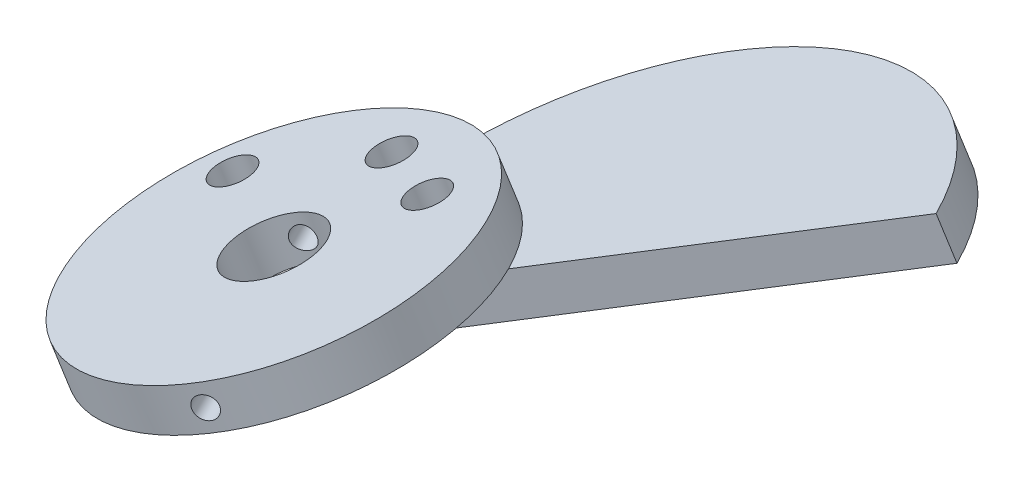
ISO-10303-21;
HEADER;
FILE_DESCRIPTION(('STEP AP214'),'2;1');
FILE_NAME('part.step','',(''),(''),'','','');
FILE_SCHEMA(('AUTOMOTIVE_DESIGN { 1 0 10303 214 1 1 1 1 }'));
ENDSEC;
DATA;
#1=APPLICATION_CONTEXT('core data for automotive mechanical design processes');
#2=APPLICATION_PROTOCOL_DEFINITION('international standard','automotive_design',2000,#1);
#3=PRODUCT_CONTEXT('',#1,'mechanical');
#4=PRODUCT('Part','Part','',(#3));
#5=PRODUCT_RELATED_PRODUCT_CATEGORY('part','',(#4));
#6=PRODUCT_DEFINITION_FORMATION('','',#4);
#7=PRODUCT_DEFINITION_CONTEXT('part definition',#1,'design');
#8=PRODUCT_DEFINITION('design','',#6,#7);
#9=PRODUCT_DEFINITION_SHAPE('','',#8);
#10=(LENGTH_UNIT() NAMED_UNIT(*) SI_UNIT(.MILLI.,.METRE.));
#11=(NAMED_UNIT(*) PLANE_ANGLE_UNIT() SI_UNIT($,.RADIAN.));
#12=(NAMED_UNIT(*) SI_UNIT($,.STERADIAN.) SOLID_ANGLE_UNIT());
#13=UNCERTAINTY_MEASURE_WITH_UNIT(LENGTH_MEASURE(1.E-05),#10,'distance_accuracy_value','');
#14=(GEOMETRIC_REPRESENTATION_CONTEXT(3) GLOBAL_UNCERTAINTY_ASSIGNED_CONTEXT((#13)) GLOBAL_UNIT_ASSIGNED_CONTEXT((#10,
#11,#12)) REPRESENTATION_CONTEXT('',''));
#15=CARTESIAN_POINT('',(0.,0.,0.));
#16=DIRECTION('',(0.,0.,1.));
#17=DIRECTION('',(1.,0.,0.));
#18=AXIS2_PLACEMENT_3D('',#15,#16,#17);
#19=CARTESIAN_POINT('',(34.7138651051531,-26.8297353879861,274.813581931701));
#20=DIRECTION('',(-0.314185564785192,0.933512565093415,0.172747566389002));
#21=DIRECTION('',(-0.947761081473609,-0.318981084774592,0.));
#22=AXIS2_PLACEMENT_3D('',#19,#20,#21);
#23=CYLINDRICAL_SURFACE('',#22,12.7);
#24=CARTESIAN_POINT('',(27.9034193202308,-25.115711909382,264.065736755248));
#25=CARTESIAN_POINT('',(27.9034914489556,-25.1620029855068,264.065879602236));
#26=CARTESIAN_POINT('',(27.9069841501051,-25.208326720369,264.064137742992));
#27=CARTESIAN_POINT('',(27.9207001292124,-25.2996987240285,264.056860896095));
#28=CARTESIAN_POINT('',(27.9309310396158,-25.3447454859606,264.05132160676));
#29=CARTESIAN_POINT('',(27.9578210658462,-25.4322292751593,264.036580308741));
#30=CARTESIAN_POINT('',(27.974477414144,-25.4746674168854,264.02737987691));
#31=CARTESIAN_POINT('',(28.0137466169364,-25.5557346131928,264.00559302488));
#32=CARTESIAN_POINT('',(28.036358093149,-25.5943645463236,263.993007388154));
#33=CARTESIAN_POINT('',(28.0869189960037,-25.6667339998765,263.964858151593));
#34=CARTESIAN_POINT('',(28.114868200342,-25.7004737238612,263.949294675778));
#35=CARTESIAN_POINT('',(28.175353696712,-25.7621166605994,263.915711729445));
#36=CARTESIAN_POINT('',(28.207890210015,-25.7900195916507,263.897692140457));
#37=CARTESIAN_POINT('',(28.2767413868408,-25.8392482701955,263.859777252081));
#38=CARTESIAN_POINT('',(28.313062505564,-25.8605625258285,263.839878753542));
#39=CARTESIAN_POINT('',(28.3884665677902,-25.8959494863166,263.798909653409));
#40=CARTESIAN_POINT('',(28.4275495266055,-25.9100221510187,263.777839045316));
#41=CARTESIAN_POINT('',(28.5074725275227,-25.930539993091,263.73521036986));
#42=CARTESIAN_POINT('',(28.5483144233258,-25.9369769088621,263.713651800184));
#43=CARTESIAN_POINT('',(28.6306052585464,-25.9420109433762,263.670779291772));
#44=CARTESIAN_POINT('',(28.6720541915198,-25.9406081452843,263.649465350443));
#45=CARTESIAN_POINT('',(28.7543626632941,-25.9300069535991,263.607787600748));
#46=CARTESIAN_POINT('',(28.7952228842991,-25.9208184711544,263.587422619118));
#47=CARTESIAN_POINT('',(28.8752626396245,-25.894918746378,263.54823209723));
#48=CARTESIAN_POINT('',(28.9144421908815,-25.878207579874,263.529406541459));
#49=CARTESIAN_POINT('',(28.989942393122,-25.8377720152415,263.493860130602));
#50=CARTESIAN_POINT('',(29.0262676123519,-25.8140591250034,263.477135885645));
#51=CARTESIAN_POINT('',(29.0950823853837,-25.7602842453992,263.446191576529));
#52=CARTESIAN_POINT('',(29.1275719258757,-25.7302222340027,263.43197152106));
#53=CARTESIAN_POINT('',(29.1877796095922,-25.6645834412548,263.406357782607));
#54=CARTESIAN_POINT('',(29.2154951325161,-25.629003651606,263.394965650271));
#55=CARTESIAN_POINT('',(29.2653056529814,-25.5533460041669,263.375240335296));
#56=CARTESIAN_POINT('',(29.2874005779582,-25.5132680883131,263.366907192149));
#57=CARTESIAN_POINT('',(29.3253291849025,-25.4296632851965,263.353408916635));
#58=CARTESIAN_POINT('',(29.3411510287991,-25.3861300613201,263.348249763954));
#59=CARTESIAN_POINT('',(29.3659695041109,-25.296908476277,263.341155078864));
#60=CARTESIAN_POINT('',(29.3749661230837,-25.2512201111817,263.339219552331));
#61=CARTESIAN_POINT('',(29.3858267280125,-25.1589657868759,263.338523578122));
#62=CARTESIAN_POINT('',(29.3876886651177,-25.1123995794345,263.339764042317));
#63=CARTESIAN_POINT('',(29.3841770500245,-25.019724441808,263.345306336851));
#64=CARTESIAN_POINT('',(29.3788035860221,-24.9736155060558,263.349608129872));
#65=CARTESIAN_POINT('',(29.3609627332386,-24.8832481043627,263.361091391816));
#66=CARTESIAN_POINT('',(29.3485078385913,-24.8389865262777,263.368267782366));
#67=CARTESIAN_POINT('',(29.31686103838,-24.7534873834626,263.385283994607));
#68=CARTESIAN_POINT('',(29.297669181011,-24.7122497971019,263.395123797245));
#69=CARTESIAN_POINT('',(29.2531326951869,-24.6340125712909,263.417201219357));
#70=CARTESIAN_POINT('',(29.2277946054813,-24.5970084891359,263.429436287946));
#71=CARTESIAN_POINT('',(29.171705749792,-24.5282340493483,263.456025677534));
#72=CARTESIAN_POINT('',(29.1409549334862,-24.4964637403795,263.470380018236));
#73=CARTESIAN_POINT('',(29.0749128461548,-24.4390154506888,263.500912423679));
#74=CARTESIAN_POINT('',(29.0396157431163,-24.4133454179248,263.51709282755));
#75=CARTESIAN_POINT('',(28.9655631452603,-24.368875202877,263.550914728562));
#76=CARTESIAN_POINT('',(28.9268076158337,-24.3500750893514,263.568556240325));
#77=CARTESIAN_POINT('',(28.8469222213204,-24.3198528098611,263.604948261984));
#78=CARTESIAN_POINT('',(28.8057885938874,-24.3084427038479,263.623700530405));
#79=CARTESIAN_POINT('',(28.7224223585892,-24.2933774059686,263.661866305932));
#80=CARTESIAN_POINT('',(28.6801897532805,-24.2897221960654,263.6812798115));
#81=CARTESIAN_POINT('',(28.5958927795759,-24.2902762835641,263.720295735645));
#82=CARTESIAN_POINT('',(28.5538283282112,-24.2944810472164,263.739898038831));
#83=CARTESIAN_POINT('',(28.4710703481219,-24.3106316331998,263.778805192604));
#84=CARTESIAN_POINT('',(28.430376804283,-24.3225773701574,263.798110046467));
#85=CARTESIAN_POINT('',(28.3516066744462,-24.353842090537,263.835861081302));
#86=CARTESIAN_POINT('',(28.3135253683547,-24.3731473384422,263.854308790492));
#87=CARTESIAN_POINT('',(28.2409729675021,-24.4185820504637,263.889844892094));
#88=CARTESIAN_POINT('',(28.2065017321525,-24.4447112486932,263.906933337436));
#89=CARTESIAN_POINT('',(28.142130389797,-24.5030383208624,263.9392108425));
#90=CARTESIAN_POINT('',(28.112228672794,-24.5352340483876,263.954400570861));
#91=CARTESIAN_POINT('',(28.0577767957731,-24.6047957224406,263.982381079073));
#92=CARTESIAN_POINT('',(28.0332279752362,-24.6421629592447,263.995171258363));
#93=CARTESIAN_POINT('',(27.9900824864828,-24.721086432502,264.017909358774));
#94=CARTESIAN_POINT('',(27.971499163499,-24.7626517913218,264.02785090204));
#95=CARTESIAN_POINT('',(27.9408432052906,-24.8486962135781,264.04444905524));
#96=CARTESIAN_POINT('',(27.9287631178511,-24.8931718761691,264.051109424404));
#97=CARTESIAN_POINT('',(27.9144856297953,-24.9675447580369,264.059113754472));
#98=CARTESIAN_POINT('',(27.910298854702,-24.9969663903056,264.061507194439));
#99=CARTESIAN_POINT('',(27.9047424939901,-25.056158144658,264.064772742167));
#100=CARTESIAN_POINT('',(27.9033729126657,-25.0859282672728,264.065644847608));
#101=CARTESIAN_POINT('',(27.9034193202308,-25.115711909382,264.065736755248));
#102=B_SPLINE_CURVE_WITH_KNOTS('',3,(#24,#25,#26,#27,#28,#29,#30,#31,#32,#33,#34,#35,#36,#37,
#38,#39,#40,#41,#42,#43,#44,#45,#46,#47,#48,#49,#50,#51,#52,#53,#54,#55,#56,#57,#58,#59,#60,#61,
#62,#63,#64,#65,#66,#67,#68,#69,#70,#71,#72,#73,#74,#75,#76,#77,#78,#79,#80,#81,#82,#83,#84,#85,
#86,#87,#88,#89,#90,#91,#92,#93,#94,#95,#96,#97,#98,#99,#100,#101),.UNSPECIFIED.,.T.,.F.,(4,2,2,
2,2,2,2,2,2,2,2,2,2,2,2,2,2,2,2,2,2,2,2,2,2,2,2,2,2,2,2,2,2,2,2,2,2,2,4),(0.,0.138765678526406,
0.277688809450887,0.416552170861587,0.555383421304641,0.694208891014165,0.833041059337556,
0.972114027685706,1.11118776715525,1.25041184243902,1.3896344408115,1.52868007511127,
1.66772430788034,1.80654127053479,1.9453587148688,2.08425211039882,2.22314729902203,
2.36230336631217,2.50145968728247,2.6406559664704,2.77985054893667,2.91880030194514,
3.05774906095489,3.19655064088989,3.33535351133192,3.47433624643409,3.6133203725184,
3.75253074281306,3.89174078931994,4.03087056218161,4.16999880064055,4.30886863662699,
4.44773306252775,4.58654844838611,4.72539853092309,4.86455710045018,5.00355586352064,
5.09283745626833,5.18211918510799),.UNSPECIFIED.);
#103=CARTESIAN_POINT('',(27.9034193202308,-25.115711909382,264.065736755248));
#104=VERTEX_POINT('',#103);
#105=EDGE_CURVE('E145',#104,#104,#102,.T.);
#106=ORIENTED_EDGE('',*,*,#105,.T.);
#107=EDGE_LOOP('',(#106));
#108=FACE_BOUND('',#107,.T.);
#109=CARTESIAN_POINT('',(34.7138651051531,-26.8297353879861,274.813581931701));
#110=DIRECTION('',(-0.314185564785192,0.933512565093415,0.172747566389002));
#111=DIRECTION('',(-0.947761081473609,-0.318981084774592,0.));
#112=AXIS2_PLACEMENT_3D('',#109,#110,#111);
#113=CIRCLE('',#112,12.7);
#114=CARTESIAN_POINT('',(45.4015764436263,-22.2821574693871,269.677205639047));
#115=VERTEX_POINT('',#114);
#116=CARTESIAN_POINT('',(33.0151322846113,-25.0946721899854,262.347874470696));
#117=VERTEX_POINT('',#116);
#118=EDGE_CURVE('E11',#115,#117,#113,.T.);
#119=ORIENTED_EDGE('',*,*,#118,.T.);
#120=EDGE_CURVE('E45',#117,#115,#113,.T.);
#121=ORIENTED_EDGE('',*,*,#120,.T.);
#122=EDGE_LOOP('',(#119,#121));
#123=FACE_BOUND('',#122,.T.);
#124=CARTESIAN_POINT('',(33.7163259369601,-23.8658329938145,275.362055454986));
#125=DIRECTION('',(-0.314185564785192,0.933512565093415,0.172747566389002));
#126=DIRECTION('',(-0.947761081473609,-0.318981084774592,0.));
#127=AXIS2_PLACEMENT_3D('',#124,#125,#126);
#128=CIRCLE('',#127,12.7);
#129=CARTESIAN_POINT('',(21.6797602022453,-27.9168927704518,275.362055454986));
#130=VERTEX_POINT('',#129);
#131=EDGE_CURVE('E108',#130,#130,#128,.T.);
#132=ORIENTED_EDGE('',*,*,#131,.F.);
#133=EDGE_LOOP('',(#132));
#134=FACE_BOUND('',#133,.T.);
#135=CARTESIAN_POINT('',(39.043756682219,-25.5798564724186,286.835481358948));
#136=CARTESIAN_POINT('',(39.044575633925,-25.5334963106448,286.83715060336));
#137=CARTESIAN_POINT('',(39.0489989031034,-25.487111208081,286.837269846749));
#138=CARTESIAN_POINT('',(39.064896889325,-25.3956320186152,286.834307892555));
#139=CARTESIAN_POINT('',(39.0763799436569,-25.3505395242217,286.831222907948));
#140=CARTESIAN_POINT('',(39.1060137889827,-25.2629774860306,286.821828978636));
#141=CARTESIAN_POINT('',(39.1241612178531,-25.2205066322344,286.815521658946));
#142=CARTESIAN_POINT('',(39.1665500905697,-25.1393772220626,286.799747664675));
#143=CARTESIAN_POINT('',(39.1907900521388,-25.1007177415831,286.790281758376));
#144=CARTESIAN_POINT('',(39.2446419499824,-25.0282733075498,286.768342634154));
#145=CARTESIAN_POINT('',(39.2742564550038,-24.9944906988044,286.755867977266));
#146=CARTESIAN_POINT('',(39.3379683385905,-24.9327820846493,286.728175856794));
#147=CARTESIAN_POINT('',(39.3720658392182,-24.9048562387604,286.712958318523));
#148=CARTESIAN_POINT('',(39.4436868406127,-24.855698729756,286.680178235952));
#149=CARTESIAN_POINT('',(39.4812048315612,-24.8344565378299,286.662619442617));
#150=CARTESIAN_POINT('',(39.55863319693,-24.7992120320002,286.625613066307));
#151=CARTESIAN_POINT('',(39.5985435450518,-24.7852096385276,286.606165504094));
#152=CARTESIAN_POINT('',(39.6795716543356,-24.76485628681,286.565976908176));
#153=CARTESIAN_POINT('',(39.7206876944038,-24.7584949184681,286.545237674877));
#154=CARTESIAN_POINT('',(39.8030386716075,-24.7535666388234,286.503080752456));
#155=CARTESIAN_POINT('',(39.8442736093119,-24.7549997648758,286.481663060084));
#156=CARTESIAN_POINT('',(39.9257765955032,-24.7656226111352,286.438816039762));
#157=CARTESIAN_POINT('',(39.9660436791163,-24.7748197664043,286.417386720342));
#158=CARTESIAN_POINT('',(40.0444854621299,-24.8007198202694,286.375245840521));
#159=CARTESIAN_POINT('',(40.082660133762,-24.8174228184486,286.354534289645));
#160=CARTESIAN_POINT('',(40.1559633858175,-24.8579019772007,286.314491473289));
#161=CARTESIAN_POINT('',(40.1910863805983,-24.8816907690666,286.295162749826));
#162=CARTESIAN_POINT('',(40.2572697976736,-24.9356614010602,286.258587106397));
#163=CARTESIAN_POINT('',(40.288330226737,-24.9658432305359,286.241340182961));
#164=CARTESIAN_POINT('',(40.345548827739,-25.0317437128946,286.209518886338));
#165=CARTESIAN_POINT('',(40.3717078029004,-25.067461456827,286.194944075267));
#166=CARTESIAN_POINT('',(40.418417741778,-25.1434253921317,286.168951378895));
#167=CARTESIAN_POINT('',(40.4389687774205,-25.1836715254144,286.157533453103));
#168=CARTESIAN_POINT('',(40.4738605790609,-25.2674679990512,286.138236267522));
#169=CARTESIAN_POINT('',(40.488212905345,-25.3110120091288,286.130350419555));
#170=CARTESIAN_POINT('',(40.5103544499616,-25.4002319311527,286.118308594509));
#171=CARTESIAN_POINT('',(40.5181436964383,-25.4459078339559,286.114152601435));
#172=CARTESIAN_POINT('',(40.5269178750506,-25.5380624529145,286.109648698744));
#173=CARTESIAN_POINT('',(40.5279072690852,-25.5845406225624,286.109298291907));
#174=CARTESIAN_POINT('',(40.5230334259759,-25.6770131467914,286.112333405287));
#175=CARTESIAN_POINT('',(40.517170114326,-25.7230074961067,286.115718966124));
#176=CARTESIAN_POINT('',(40.4986963386078,-25.8132853304527,286.126038355949));
#177=CARTESIAN_POINT('',(40.4860751913971,-25.857565987212,286.132977802347));
#178=CARTESIAN_POINT('',(40.4543812011222,-25.9430877030783,286.150098113812));
#179=CARTESIAN_POINT('',(40.435308299786,-25.9843287347274,286.160279008155));
#180=CARTESIAN_POINT('',(40.3911619432331,-26.0626575206856,286.183496435765));
#181=CARTESIAN_POINT('',(40.3660804010595,-26.0997395778757,286.196536815558));
#182=CARTESIAN_POINT('',(40.3105883465934,-26.1686301743863,286.22499295363));
#183=CARTESIAN_POINT('',(40.2801778690578,-26.2004387480996,286.240408696416));
#184=CARTESIAN_POINT('',(40.2148826988486,-26.2578450980294,286.273081776794));
#185=CARTESIAN_POINT('',(40.1800024407628,-26.2834489582821,286.290337286292));
#186=CARTESIAN_POINT('',(40.1067121786844,-26.3277536630874,286.326163492294));
#187=CARTESIAN_POINT('',(40.0683022211711,-26.3464545985217,286.344734171479));
#188=CARTESIAN_POINT('',(39.989112657247,-26.3763930109237,286.382616815726));
#189=CARTESIAN_POINT('',(39.948337395517,-26.3876437283737,286.401927400847));
#190=CARTESIAN_POINT('',(39.8655266219706,-26.402418234194,286.440800345236));
#191=CARTESIAN_POINT('',(39.8234911060415,-26.4059419973463,286.460362705325));
#192=CARTESIAN_POINT('',(39.7393736468843,-26.4051678104281,286.499251720985));
#193=CARTESIAN_POINT('',(39.6972916962098,-26.4008683372073,286.518578329918));
#194=CARTESIAN_POINT('',(39.6143220352167,-26.3845721469264,286.556537816606));
#195=CARTESIAN_POINT('',(39.5734343422371,-26.3725753181695,286.57517068429));
#196=CARTESIAN_POINT('',(39.4939833364697,-26.3411972132357,286.611361455177));
#197=CARTESIAN_POINT('',(39.4554245550312,-26.3218020463539,286.628917263735));
#198=CARTESIAN_POINT('',(39.3818630264005,-26.2761799158322,286.662534848789));
#199=CARTESIAN_POINT('',(39.3468601615818,-26.2499531782771,286.678596674703));
#200=CARTESIAN_POINT('',(39.2814360794439,-26.1913938739874,286.708889094844));
#201=CARTESIAN_POINT('',(39.2510173205125,-26.1590580518416,286.72311870589));
#202=CARTESIAN_POINT('',(39.1956878146931,-26.0891969396802,286.749424235534));
#203=CARTESIAN_POINT('',(39.170778323086,-26.0516704701405,286.761499663181));
#204=CARTESIAN_POINT('',(39.1272435305822,-25.9725530559584,286.78319468757));
#205=CARTESIAN_POINT('',(39.1086111265814,-25.9309667745947,286.792817057151));
#206=CARTESIAN_POINT('',(39.0781513738848,-25.8449071556739,286.809364695383));
#207=CARTESIAN_POINT('',(39.0663160947989,-25.8004372502435,286.816293104089));
#208=CARTESIAN_POINT('',(39.052765808179,-25.7263894617051,286.825255167021));
#209=CARTESIAN_POINT('',(39.0489351305265,-25.6972831810705,286.828152523612));
#210=CARTESIAN_POINT('',(39.0441704812169,-25.6387401114428,286.832735486614));
#211=CARTESIAN_POINT('',(39.0432365039523,-25.6093033230896,286.834421095372));
#212=CARTESIAN_POINT('',(39.043756682219,-25.5798564724186,286.835481358948));
#213=B_SPLINE_CURVE_WITH_KNOTS('',3,(#135,#136,#137,#138,#139,#140,#141,#142,#143,#144,#145,
#146,#147,#148,#149,#150,#151,#152,#153,#154,#155,#156,#157,#158,#159,#160,#161,#162,#163,#164,
#165,#166,#167,#168,#169,#170,#171,#172,#173,#174,#175,#176,#177,#178,#179,#180,#181,#182,#183,
#184,#185,#186,#187,#188,#189,#190,#191,#192,#193,#194,#195,#196,#197,#198,#199,#200,#201,#202,
#203,#204,#205,#206,#207,#208,#209,#210,#211,#212),.UNSPECIFIED.,.T.,.F.,(4,2,2,2,2,2,2,2,2,2,2,
2,2,2,2,2,2,2,2,2,2,2,2,2,2,2,2,2,2,2,2,2,2,2,2,2,2,2,4),(0.,0.139084671145376,
0.278333911383219,0.41751299778872,0.556658255469263,0.695870193194237,0.835085922150107,
0.974081232602476,1.11307501539841,1.25187921814807,1.390684086118,1.52962202868416,
1.66856181465141,1.80775077533058,1.94693950409665,2.08610540340532,2.22526951771661,
2.36417296523408,2.50307581709227,2.64188751554408,2.78070072324252,2.91973402488384,
3.05876858230074,3.19799132644983,3.33721316257782,3.47629792719446,3.6153808605993,
3.7542159485074,3.89305148952103,4.03191406410424,4.17077865377828,4.30990526145625,
4.44902726544826,4.58822361500613,4.72745164771054,4.86652159765163,5.00542895954282,
5.0937723413073,5.18211555205394),.UNSPECIFIED.);
#214=CARTESIAN_POINT('',(39.043756682219,-25.5798564724186,286.835481358948));
#215=VERTEX_POINT('',#214);
#216=EDGE_CURVE('E123',#215,#215,#213,.T.);
#217=ORIENTED_EDGE('',*,*,#216,.T.);
#218=EDGE_LOOP('',(#217));
#219=FACE_BOUND('',#218,.T.);
#220=ADVANCED_FACE('F32',(#108,#123,#134,#219),#23,.T.);
#221=CARTESIAN_POINT('',(34.7138651051531,-26.8297353879861,274.813581931701));
#222=DIRECTION('',(-0.314185564785192,0.933512565093415,0.172747566389002));
#223=DIRECTION('',(-0.947761081473609,-0.318981084774592,0.));
#224=AXIS2_PLACEMENT_3D('',#221,#222,#223);
#225=CYLINDRICAL_SURFACE('',#224,3.175);
#226=CARTESIAN_POINT('',(32.1202050853295,-25.2913976290119,272.684428613489));
#227=CARTESIAN_POINT('',(32.1216133960569,-25.3363959199763,272.687305338985));
#228=CARTESIAN_POINT('',(32.1260061295399,-25.3814547450878,272.687916238532));
#229=CARTESIAN_POINT('',(32.1405680630878,-25.4704380518034,272.684298164624));
#230=CARTESIAN_POINT('',(32.1507378627417,-25.5143624151694,272.680068688752));
#231=CARTESIAN_POINT('',(32.1765367214097,-25.5998241195621,272.666754401199));
#232=CARTESIAN_POINT('',(32.1921675346604,-25.6413606885608,272.657668028843));
#233=CARTESIAN_POINT('',(32.2284490082846,-25.7208391052001,272.634949055985));
#234=CARTESIAN_POINT('',(32.2490997539543,-25.7587808917447,272.621316378232));
#235=CARTESIAN_POINT('',(32.2948304868485,-25.8299258325806,272.590153417055));
#236=CARTESIAN_POINT('',(32.3198967103659,-25.8631431484945,272.572635202691));
#237=CARTESIAN_POINT('',(32.3739506873905,-25.9241503356499,272.534477919109));
#238=CARTESIAN_POINT('',(32.4029390895348,-25.9519393073081,272.513838333622));
#239=CARTESIAN_POINT('',(32.4651324979672,-26.0021311400834,272.469749662695));
#240=CARTESIAN_POINT('',(32.4984332795506,-26.0243602299013,272.446237813901));
#241=CARTESIAN_POINT('',(32.5679321338037,-26.0618393527718,272.397958625001));
#242=CARTESIAN_POINT('',(32.6041306101488,-26.0770884114475,272.373191110146));
#243=CARTESIAN_POINT('',(32.6794467340844,-26.1004239024001,272.322993988495));
#244=CARTESIAN_POINT('',(32.7186078170721,-26.1083634377293,272.297560945474));
#245=CARTESIAN_POINT('',(32.7983164288273,-26.1162812263272,272.247642830767));
#246=CARTESIAN_POINT('',(32.838863769399,-26.1162605560017,272.223157631358));
#247=CARTESIAN_POINT('',(32.9195861300862,-26.1082688568959,272.176592703482));
#248=CARTESIAN_POINT('',(32.9597548566423,-26.1004398977567,272.154477810175));
#249=CARTESIAN_POINT('',(33.0393219156569,-26.0772319101548,272.113001011725));
#250=CARTESIAN_POINT('',(33.0787203859107,-26.0618542452115,272.093638610215));
#251=CARTESIAN_POINT('',(33.1545453124506,-26.0245145401453,272.058748733676));
#252=CARTESIAN_POINT('',(33.1910229357932,-26.0027384259359,272.043132987214));
#253=CARTESIAN_POINT('',(33.2610593447568,-25.9531137605002,272.015406744883));
#254=CARTESIAN_POINT('',(33.29461804838,-25.9252650387602,272.003296347463));
#255=CARTESIAN_POINT('',(33.3579593267491,-25.8641577844741,271.982611647062));
#256=CARTESIAN_POINT('',(33.3877237763482,-25.8308748994993,271.974053906419));
#257=CARTESIAN_POINT('',(33.4423934152369,-25.7598962966155,271.960421502877));
#258=CARTESIAN_POINT('',(33.4672977371357,-25.7221997929219,271.955347461312));
#259=CARTESIAN_POINT('',(33.5120911222247,-25.642210939316,271.948297764022));
#260=CARTESIAN_POINT('',(33.5318137557479,-25.5998169967243,271.946416251145));
#261=CARTESIAN_POINT('',(33.5645245799144,-25.5124745976138,271.945625064506));
#262=CARTESIAN_POINT('',(33.5775121302968,-25.4675258986812,271.946715673222));
#263=CARTESIAN_POINT('',(33.5962458228494,-25.3757541146258,271.951429276902));
#264=CARTESIAN_POINT('',(33.6019118937599,-25.3289159871066,271.955079610881));
#265=CARTESIAN_POINT('',(33.6053127425988,-25.2351606818947,271.964461693924));
#266=CARTESIAN_POINT('',(33.6030492153498,-25.1882435232361,271.97019299798));
#267=CARTESIAN_POINT('',(33.5906265263752,-25.0969249936626,271.98313932959));
#268=CARTESIAN_POINT('',(33.5806713588346,-25.0524899608921,271.990312532891));
#269=CARTESIAN_POINT('',(33.5533323138923,-24.9662054366675,272.005919881167));
#270=CARTESIAN_POINT('',(33.5359494576943,-24.9243555906912,272.014353852702));
#271=CARTESIAN_POINT('',(33.4947935635786,-24.8453771324836,272.032092846975));
#272=CARTESIAN_POINT('',(33.4711727144236,-24.8081636335949,272.041374069416));
#273=CARTESIAN_POINT('',(33.4181725494867,-24.7383840958532,272.060904929502));
#274=CARTESIAN_POINT('',(33.3887926365373,-24.7058185395592,272.071154667516));
#275=CARTESIAN_POINT('',(33.3247231318119,-24.6456635863723,272.09283917245));
#276=CARTESIAN_POINT('',(33.2899540917195,-24.6181649353528,272.104290670106));
#277=CARTESIAN_POINT('',(33.2165939342401,-24.5694906573615,272.128342134015));
#278=CARTESIAN_POINT('',(33.1780021072879,-24.5483162071936,272.140942313446));
#279=CARTESIAN_POINT('',(33.0970034406777,-24.5122975712446,272.167802222823));
#280=CARTESIAN_POINT('',(33.0545175335896,-24.4976590939909,272.182100009235));
#281=CARTESIAN_POINT('',(32.9681127246549,-24.4760837572804,272.212118546654));
#282=CARTESIAN_POINT('',(32.9241938363264,-24.4691468251917,272.227839284241));
#283=CARTESIAN_POINT('',(32.8364239120599,-24.4632447464967,272.260634712985));
#284=CARTESIAN_POINT('',(32.7925729286643,-24.464262798163,272.277706475138));
#285=CARTESIAN_POINT('',(32.7062805516591,-24.474278008433,272.313027338727));
#286=CARTESIAN_POINT('',(32.6638388589505,-24.4832734625882,272.331276187894));
#287=CARTESIAN_POINT('',(32.582928834882,-24.5086392426555,272.368012159299));
#288=CARTESIAN_POINT('',(32.5443810712006,-24.5247886622699,272.386477111318));
#289=CARTESIAN_POINT('',(32.471037162406,-24.5639215822831,272.423605671406));
#290=CARTESIAN_POINT('',(32.4362407328298,-24.5869045639967,272.442269264294));
#291=CARTESIAN_POINT('',(32.3716805790238,-24.638712312113,272.478922331705));
#292=CARTESIAN_POINT('',(32.3418647714247,-24.6674686450626,272.496917020119));
#293=CARTESIAN_POINT('',(32.2874381317645,-24.7301551171658,272.531733378768));
#294=CARTESIAN_POINT('',(32.2628283541022,-24.7640863020135,272.548554810917));
#295=CARTESIAN_POINT('',(32.2187479732544,-24.8370280139531,272.580631825112));
#296=CARTESIAN_POINT('',(32.1994080975341,-24.8761371399187,272.595842677619));
#297=CARTESIAN_POINT('',(32.16689833942,-24.9577603032726,272.623437186808));
#298=CARTESIAN_POINT('',(32.1537273188777,-25.0002737108776,272.635821364792));
#299=CARTESIAN_POINT('',(32.1345344192585,-25.0838498554853,272.656085879005));
#300=CARTESIAN_POINT('',(32.1279953184764,-25.1247231508647,272.66426185911));
#301=CARTESIAN_POINT('',(32.1201741913244,-25.2075126978406,272.677091507922));
#302=CARTESIAN_POINT('',(32.1188915887032,-25.2494288346071,272.681745562681));
#303=CARTESIAN_POINT('',(32.1202050853295,-25.2913976290119,272.684428613489));
#304=B_SPLINE_CURVE_WITH_KNOTS('',3,(#226,#227,#228,#229,#230,#231,#232,#233,#234,#235,#236,
#237,#238,#239,#240,#241,#242,#243,#244,#245,#246,#247,#248,#249,#250,#251,#252,#253,#254,#255,
#256,#257,#258,#259,#260,#261,#262,#263,#264,#265,#266,#267,#268,#269,#270,#271,#272,#273,#274,
#275,#276,#277,#278,#279,#280,#281,#282,#283,#284,#285,#286,#287,#288,#289,#290,#291,#292,#293,
#294,#295,#296,#297,#298,#299,#300,#301,#302,#303),.UNSPECIFIED.,.T.,.F.,(4,2,2,2,2,2,2,2,2,2,2,
2,2,2,2,2,2,2,2,2,2,2,2,2,2,2,2,2,2,2,2,2,2,2,2,2,2,2,4),(0.,0.135191335052145,0.27039670388077,
0.405645544603208,0.540896683568904,0.675733453427245,0.810592549469725,0.949250483807529,
1.08792776819046,1.22933476572717,1.37072264174002,1.50958409183194,1.64842046866388,
1.78356565633783,1.91871463926229,2.05448679130994,2.19028315260332,2.33001850451405,
2.46976713772829,2.61103154306525,2.75226575727583,2.88987763234411,3.02747059378032,
3.16197520380669,3.29649376823642,3.43322684743852,3.56998535403086,3.71078795377371,
3.85158922562066,3.99209319150072,4.13256714459311,4.26897678486515,4.40537607393018,
4.54024506299278,4.67514134153941,4.81312964555387,4.95109248080774,5.07719592406677,
5.20328554268348),.UNSPECIFIED.);
#305=CARTESIAN_POINT('',(32.1202050853295,-25.2913976290119,272.684428613489));
#306=VERTEX_POINT('',#305);
#307=EDGE_CURVE('E124',#306,#306,#304,.T.);
#308=ORIENTED_EDGE('',*,*,#307,.F.);
#309=EDGE_LOOP('',(#308));
#310=FACE_BOUND('',#309,.T.);
#311=CARTESIAN_POINT('',(34.7138651051531,-26.8297353879861,274.813581931701));
#312=DIRECTION('',(-0.314185564785192,0.933512565093415,0.172747566389002));
#313=DIRECTION('',(-0.947761081473609,-0.318981084774592,0.));
#314=AXIS2_PLACEMENT_3D('',#311,#312,#313);
#315=CIRCLE('',#314,3.175);
#316=CARTESIAN_POINT('',(37.3857929397713,-25.6928409083363,273.529487858538));
#317=VERTEX_POINT('',#316);
#318=CARTESIAN_POINT('',(33.5462646354941,-26.6770711472194,271.86501825207));
#319=VERTEX_POINT('',#318);
#320=EDGE_CURVE('E106',#317,#319,#315,.T.);
#321=ORIENTED_EDGE('',*,*,#320,.F.);
#322=EDGE_CURVE('E101',#319,#317,#315,.T.);
#323=ORIENTED_EDGE('',*,*,#322,.F.);
#324=EDGE_LOOP('',(#321,#323));
#325=FACE_BOUND('',#324,.T.);
#326=CARTESIAN_POINT('',(33.7163259369601,-23.8658329938145,275.362055454986));
#327=DIRECTION('',(-0.314185564785192,0.933512565093415,0.172747566389002));
#328=DIRECTION('',(-0.947761081473609,-0.318981084774592,0.));
#329=AXIS2_PLACEMENT_3D('',#326,#327,#328);
#330=CIRCLE('',#329,3.175);
#331=CARTESIAN_POINT('',(30.7071845032814,-24.8785979379738,275.362055454986));
#332=VERTEX_POINT('',#331);
#333=EDGE_CURVE('E98',#332,#332,#330,.T.);
#334=ORIENTED_EDGE('',*,*,#333,.T.);
#335=EDGE_LOOP('',(#334));
#336=FACE_BOUND('',#335,.T.);
#337=CARTESIAN_POINT('',(34.8269709171202,-25.4041707527887,278.216789500708));
#338=CARTESIAN_POINT('',(34.8291855111327,-25.3575874874623,278.221312945638));
#339=CARTESIAN_POINT('',(34.8353056901423,-25.3110713945583,278.224794226007));
#340=CARTESIAN_POINT('',(34.854937844899,-25.219477681355,278.229196942015));
#341=CARTESIAN_POINT('',(34.8684561486532,-25.174401327524,278.2301161821));
#342=CARTESIAN_POINT('',(34.9022450889819,-25.0869426529432,278.228918583921));
#343=CARTESIAN_POINT('',(34.9225097811994,-25.0445579995018,278.226804413039));
#344=CARTESIAN_POINT('',(34.969027694731,-24.9635616480603,278.219127672453));
#345=CARTESIAN_POINT('',(34.9952798977948,-24.9249493101242,278.213565688816));
#346=CARTESIAN_POINT('',(35.0530530010504,-24.8523399758376,278.198647211925));
#347=CARTESIAN_POINT('',(35.0846031237179,-24.8183705860498,278.189269237761));
#348=CARTESIAN_POINT('',(35.1518265958089,-24.7563282154329,278.166596812542));
#349=CARTESIAN_POINT('',(35.1874992709894,-24.7282542725143,278.153303001371));
#350=CARTESIAN_POINT('',(35.2608706455084,-24.6795105621724,278.123317297476));
#351=CARTESIAN_POINT('',(35.2984957386624,-24.6586721993019,278.106719368701));
#352=CARTESIAN_POINT('',(35.3754136561195,-24.6240777497597,278.070324307054));
#353=CARTESIAN_POINT('',(35.4147062633894,-24.6103207444645,278.05052758958));
#354=CARTESIAN_POINT('',(35.49300644512,-24.5904844696374,278.00881458054));
#355=CARTESIAN_POINT('',(35.5320033906088,-24.5842538057899,277.986949970057));
#356=CARTESIAN_POINT('',(35.6095111617626,-24.5790861407432,277.941565052333));
#357=CARTESIAN_POINT('',(35.6480219485364,-24.5801497194042,277.918044613608));
#358=CARTESIAN_POINT('',(35.7242267405153,-24.5895552662799,277.869917779969));
#359=CARTESIAN_POINT('',(35.7619009334791,-24.5980020671736,277.845300610732));
#360=CARTESIAN_POINT('',(35.835069558789,-24.622053720541,277.796320014751));
#361=CARTESIAN_POINT('',(35.8705635730115,-24.6376599412477,277.771956637421));
#362=CARTESIAN_POINT('',(35.9396615925347,-24.6761729667808,277.723848443743));
#363=CARTESIAN_POINT('',(35.9731830190363,-24.6992749712241,277.7001409858));
#364=CARTESIAN_POINT('',(36.0365235874225,-24.7520451928949,277.65520947347));
#365=CARTESIAN_POINT('',(36.0663427012688,-24.7817134598454,277.633985437889));
#366=CARTESIAN_POINT('',(36.1216312098649,-24.8468521970277,277.595061183014));
#367=CARTESIAN_POINT('',(36.1471010922352,-24.8823220159358,277.577360568648));
#368=CARTESIAN_POINT('',(36.1930649958729,-24.9580810432352,277.546366327893));
#369=CARTESIAN_POINT('',(36.2135602285029,-24.9983690747834,277.533071628344));
#370=CARTESIAN_POINT('',(36.2484712861178,-25.0812817954661,277.511828600795));
#371=CARTESIAN_POINT('',(36.2630528658739,-25.1237983347795,277.503730140644));
#372=CARTESIAN_POINT('',(36.2865834416222,-25.2109874642272,277.492494794725));
#373=CARTESIAN_POINT('',(36.2955327838066,-25.2556599216636,277.489357603989));
#374=CARTESIAN_POINT('',(36.3074230048307,-25.345282109366,277.487966231867));
#375=CARTESIAN_POINT('',(36.3104391989247,-25.3902210025603,277.489650167342));
#376=CARTESIAN_POINT('',(36.3105279423301,-25.4797228661707,277.497409443709));
#377=CARTESIAN_POINT('',(36.3075996246629,-25.5242857808005,277.503485425077));
#378=CARTESIAN_POINT('',(36.2955929811301,-25.6129929415261,277.519678959364));
#379=CARTESIAN_POINT('',(36.2863626305419,-25.6570988229066,277.529893819276));
#380=CARTESIAN_POINT('',(36.2616438740162,-25.7425843550723,277.553638966792));
#381=CARTESIAN_POINT('',(36.2461544478642,-25.7839635601362,277.567169794748));
#382=CARTESIAN_POINT('',(36.2086390535973,-25.8638710186175,277.597116509954));
#383=CARTESIAN_POINT('',(36.1864650980857,-25.902306987802,277.613593857336));
#384=CARTESIAN_POINT('',(36.1360897014049,-25.9740909199861,277.648328855589));
#385=CARTESIAN_POINT('',(36.1078888319513,-26.0074393650765,277.666586337508));
#386=CARTESIAN_POINT('',(36.0464543252617,-26.0676412674582,277.703785282515));
#387=CARTESIAN_POINT('',(36.0132901207184,-26.0945727815907,277.722714920682));
#388=CARTESIAN_POINT('',(35.9425156651575,-26.1416358120208,277.760709171043));
#389=CARTESIAN_POINT('',(35.9049063070037,-26.1617686907847,277.779773755409));
#390=CARTESIAN_POINT('',(35.8274611681977,-26.1941391994015,277.816854622374));
#391=CARTESIAN_POINT('',(35.7877191181444,-26.2065850727342,277.83488529867));
#392=CARTESIAN_POINT('',(35.706256919541,-26.224134611646,277.870019692704));
#393=CARTESIAN_POINT('',(35.6645367739842,-26.2292382883355,277.887123411847));
#394=CARTESIAN_POINT('',(35.580426309212,-26.2320171826983,277.92011275712));
#395=CARTESIAN_POINT('',(35.5380366540956,-26.2296993515732,277.935999508823));
#396=CARTESIAN_POINT('',(35.4538138445559,-26.2177823260467,277.966463112787));
#397=CARTESIAN_POINT('',(35.4119807825852,-26.20818193697,277.98103974969));
#398=CARTESIAN_POINT('',(35.3289707300831,-26.1816295397054,278.009284220438));
#399=CARTESIAN_POINT('',(35.2878442194871,-26.1644807799101,278.022915575538));
#400=CARTESIAN_POINT('',(35.2087734893241,-26.1232684966987,278.048911422603));
#401=CARTESIAN_POINT('',(35.1708296449898,-26.0992041594201,278.061275765226));
#402=CARTESIAN_POINT('',(35.098784974905,-26.0443353248136,278.085053278107));
#403=CARTESIAN_POINT('',(35.0647552861464,-26.0134292220565,278.096448081626));
#404=CARTESIAN_POINT('',(35.0024655437181,-25.9459351938189,278.118154703207));
#405=CARTESIAN_POINT('',(34.9742050637578,-25.909347688493,278.128466601258));
#406=CARTESIAN_POINT('',(34.9250341889084,-25.832375737323,278.147796286428));
#407=CARTESIAN_POINT('',(34.9039795062324,-25.7920892475968,278.156837036491));
#408=CARTESIAN_POINT('',(34.8691462848113,-25.7082796100177,278.173750854403));
#409=CARTESIAN_POINT('',(34.8553623886835,-25.6647588723307,278.181624778927));
#410=CARTESIAN_POINT('',(34.837515391485,-25.585033376765,278.194465534414));
#411=CARTESIAN_POINT('',(34.8320297674418,-25.5491815537072,278.199696660456));
#412=CARTESIAN_POINT('',(34.8258931702233,-25.47692977843,278.209093350761));
#413=CARTESIAN_POINT('',(34.8252423878306,-25.4405298046375,278.213258872969));
#414=CARTESIAN_POINT('',(34.8269709171202,-25.4041707527887,278.216789500708));
#415=B_SPLINE_CURVE_WITH_KNOTS('',3,(#337,#338,#339,#340,#341,#342,#343,#344,#345,#346,#347,
#348,#349,#350,#351,#352,#353,#354,#355,#356,#357,#358,#359,#360,#361,#362,#363,#364,#365,#366,
#367,#368,#369,#370,#371,#372,#373,#374,#375,#376,#377,#378,#379,#380,#381,#382,#383,#384,#385,
#386,#387,#388,#389,#390,#391,#392,#393,#394,#395,#396,#397,#398,#399,#400,#401,#402,#403,#404,
#405,#406,#407,#408,#409,#410,#411,#412,#413,#414),.UNSPECIFIED.,.T.,.F.,(4,2,2,2,2,2,2,2,2,2,2,
2,2,2,2,2,2,2,2,2,2,2,2,2,2,2,2,2,2,2,2,2,2,2,2,2,2,2,4),(0.,0.140428478220209,
0.280977260503126,0.42140252920434,0.561803934634049,0.703006866638815,0.844186737522071,
0.981812686772433,1.11942077810354,1.25421211812056,1.38901417357939,1.52576192453199,
1.66253582017138,1.80320369991637,1.94387264490007,2.08452580820409,2.22514468702101,
2.36149219472597,2.49783132084892,2.63242829773861,2.76704490636173,2.90502927824046,
3.04303615032619,3.1843559568102,3.32566236358627,3.46515040556153,3.6046104771158,
3.74010457799249,3.87559847383291,4.01096549925863,4.14635473592337,4.28550374568013,
4.42466913795482,4.56605938959341,4.70743919002711,4.84579488702422,4.98404849554916,
5.09365104954222,5.20325792842611),.UNSPECIFIED.);
#416=CARTESIAN_POINT('',(34.8269709171202,-25.4041707527887,278.216789500708));
#417=VERTEX_POINT('',#416);
#418=EDGE_CURVE('E36',#417,#417,#415,.T.);
#419=ORIENTED_EDGE('',*,*,#418,.F.);
#420=EDGE_LOOP('',(#419));
#421=FACE_BOUND('',#420,.T.);
#422=ADVANCED_FACE('F128',(#310,#325,#336,#421),#225,.F.);
#423=CARTESIAN_POINT('',(34.7138651051531,-26.8297353879861,274.813581931701));
#424=DIRECTION('',(-0.314185564785192,0.933512565093415,0.172747566389002));
#425=DIRECTION('',(-0.947761081473609,-0.318981084774592,0.));
#426=AXIS2_PLACEMENT_3D('',#423,#424,#425);
#427=PLANE('',#426);
#428=CARTESIAN_POINT('',(26.5243363212512,-28.6354633536127,269.676826608367));
#429=DIRECTION('',(-0.314185564785192,0.933512565093415,0.172747566389002));
#430=DIRECTION('',(-0.947761081473609,-0.318981084774592,0.));
#431=AXIS2_PLACEMENT_3D('',#428,#429,#430);
#432=CIRCLE('',#431,1.47319999999997);
#433=CARTESIAN_POINT('',(25.1280946960243,-29.1053862877027,269.676826608367));
#434=VERTEX_POINT('',#433);
#435=EDGE_CURVE('E115',#434,#434,#432,.T.);
#436=ORIENTED_EDGE('',*,*,#435,.T.);
#437=EDGE_LOOP('',(#436));
#438=FACE_BOUND('',#437,.T.);
#439=CARTESIAN_POINT('',(50.7454321128628,-20.0083685100877,267.10901749272));
#440=DIRECTION('',(0.314185564785192,-0.933512565093415,-0.172747566389002));
#441=DIRECTION('',(-0.947761081473609,-0.318981084774592,0.));
#442=AXIS2_PLACEMENT_3D('',#439,#440,#441);
#443=CIRCLE('',#442,19.05);
#444=EDGE_CURVE('E161',#319,#117,#443,.T.);
#445=ORIENTED_EDGE('',*,*,#444,.F.);
#446=ORIENTED_EDGE('',*,*,#322,.T.);
#447=DIRECTION('',(-0.841552073895536,-0.358077001464487,0.404439078161749));
#448=VECTOR('',#447,1.);
#449=CARTESIAN_POINT('',(66.7769991205727,-13.1870016321892,259.404453053739));
#450=LINE('',#449,#448);
#451=EDGE_CURVE('E56',#115,#317,#450,.T.);
#452=ORIENTED_EDGE('',*,*,#451,.F.);
#453=ORIENTED_EDGE('',*,*,#120,.F.);
#454=EDGE_LOOP('',(#445,#446,#452,#453));
#455=FACE_BOUND('',#454,.T.);
#456=ADVANCED_FACE('F169',(#438,#455),#427,.F.);
#457=CARTESIAN_POINT('',(33.7163259369601,-23.8658329938145,275.362055454986));
#458=DIRECTION('',(-0.314185564785192,0.933512565093415,0.172747566389002));
#459=DIRECTION('',(-0.947761081473609,-0.318981084774592,0.));
#460=AXIS2_PLACEMENT_3D('',#457,#458,#459);
#461=PLANE('',#460);
#462=CARTESIAN_POINT('',(38.9208367633072,-20.975905508683,269.210875045418));
#463=DIRECTION('',(-0.314185564785192,0.933512565093415,0.172747566389002));
#464=DIRECTION('',(-0.947761081473609,-0.318981084774592,0.));
#465=AXIS2_PLACEMENT_3D('',#462,#463,#464);
#466=CIRCLE('',#465,1.47319999999997);
#467=CARTESIAN_POINT('',(37.5245951380803,-21.4458284427729,269.210875045418));
#468=VERTEX_POINT('',#467);
#469=EDGE_CURVE('E120',#468,#468,#466,.T.);
#470=ORIENTED_EDGE('',*,*,#469,.F.);
#471=EDGE_LOOP('',(#470));
#472=FACE_BOUND('',#471,.T.);
#473=CARTESIAN_POINT('',(33.588170692156,-22.2727626863795,266.520161418707));
#474=DIRECTION('',(-0.314185564785192,0.933512565093415,0.172747566389002));
#475=DIRECTION('',(-0.947761081473609,-0.318981084774592,0.));
#476=AXIS2_PLACEMENT_3D('',#473,#474,#475);
#477=CIRCLE('',#476,1.47319999999996);
#478=CARTESIAN_POINT('',(32.1919290669291,-22.7426856204694,266.520161418707));
#479=VERTEX_POINT('',#478);
#480=EDGE_CURVE('E116',#479,#479,#477,.T.);
#481=ORIENTED_EDGE('',*,*,#480,.F.);
#482=EDGE_LOOP('',(#481));
#483=FACE_BOUND('',#482,.T.);
#484=CARTESIAN_POINT('',(25.5267971530582,-25.6715609594411,270.225300131652));
#485=DIRECTION('',(-0.314185564785192,0.933512565093415,0.172747566389002));
#486=DIRECTION('',(-0.947761081473609,-0.318981084774592,0.));
#487=AXIS2_PLACEMENT_3D('',#484,#485,#486);
#488=CIRCLE('',#487,1.47319999999997);
#489=CARTESIAN_POINT('',(24.1305555278314,-26.1414838935311,270.225300131652));
#490=VERTEX_POINT('',#489);
#491=EDGE_CURVE('E112',#490,#490,#488,.T.);
#492=ORIENTED_EDGE('',*,*,#491,.F.);
#493=EDGE_LOOP('',(#492));
#494=FACE_BOUND('',#493,.T.);
#495=ORIENTED_EDGE('',*,*,#333,.F.);
#496=EDGE_LOOP('',(#495));
#497=FACE_BOUND('',#496,.T.);
#498=ORIENTED_EDGE('',*,*,#131,.T.);
#499=EDGE_LOOP('',(#498));
#500=FACE_BOUND('',#499,.T.);
#501=ADVANCED_FACE('F171',(#472,#483,#494,#497,#500),#461,.T.);
#502=CARTESIAN_POINT('',(50.7454321128628,-20.0083685100877,267.10901749272));
#503=DIRECTION('',(-0.314185564785192,0.933512565093415,0.172747566389002));
#504=DIRECTION('',(-0.947761081473609,-0.318981084774592,0.));
#505=AXIS2_PLACEMENT_3D('',#502,#503,#504);
#506=PLANE('',#505);
#507=ORIENTED_EDGE('',*,*,#320,.T.);
#508=CARTESIAN_POINT('',(34.7138651051528,-26.8297353879861,274.813581931701));
#509=VERTEX_POINT('',#508);
#510=EDGE_CURVE('E159',#509,#319,#443,.T.);
#511=ORIENTED_EDGE('',*,*,#510,.F.);
#512=EDGE_CURVE('E160',#317,#509,#450,.T.);
#513=ORIENTED_EDGE('',*,*,#512,.F.);
#514=EDGE_LOOP('',(#507,#511,#513));
#515=FACE_BOUND('',#514,.T.);
#516=ADVANCED_FACE('F165',(#515),#506,.T.);
#517=CARTESIAN_POINT('',(51.7429712810558,-22.9722709042593,266.560543969435));
#518=DIRECTION('',(-0.314185564785192,0.933512565093415,0.172747566389002));
#519=DIRECTION('',(-0.947761081473609,-0.318981084774592,0.));
#520=AXIS2_PLACEMENT_3D('',#517,#518,#519);
#521=CYLINDRICAL_SURFACE('',#520,19.05);
#522=ORIENTED_EDGE('',*,*,#510,.T.);
#523=ORIENTED_EDGE('',*,*,#444,.T.);
#524=CARTESIAN_POINT('',(66.7769991205727,-13.1870016321892,259.404453053739));
#525=VERTEX_POINT('',#524);
#526=EDGE_CURVE('E96',#117,#525,#443,.T.);
#527=ORIENTED_EDGE('',*,*,#526,.T.);
#528=DIRECTION('',(-0.314185564785192,0.933512565093415,0.172747566389002));
#529=VECTOR('',#528,1.);
#530=CARTESIAN_POINT('',(67.7745382887657,-16.1509040263608,258.855979530453));
#531=LINE('',#530,#529);
#532=CARTESIAN_POINT('',(67.7745382887657,-16.1509040263608,258.855979530453));
#533=VERTEX_POINT('',#532);
#534=EDGE_CURVE('E81',#533,#525,#531,.T.);
#535=ORIENTED_EDGE('',*,*,#534,.F.);
#536=CARTESIAN_POINT('',(51.7429712810558,-22.9722709042593,266.560543969435));
#537=DIRECTION('',(0.314185564785192,-0.933512565093415,-0.172747566389002));
#538=DIRECTION('',(-0.947761081473609,-0.318981084774592,0.));
#539=AXIS2_PLACEMENT_3D('',#536,#537,#538);
#540=CIRCLE('',#539,19.05);
#541=CARTESIAN_POINT('',(35.7114042733458,-29.7936377821577,274.265108408416));
#542=VERTEX_POINT('',#541);
#543=EDGE_CURVE('E86',#542,#533,#540,.T.);
#544=ORIENTED_EDGE('',*,*,#543,.F.);
#545=DIRECTION('',(-0.314185564785192,0.933512565093415,0.172747566389002));
#546=VECTOR('',#545,1.);
#547=CARTESIAN_POINT('',(35.7114042733458,-29.7936377821577,274.265108408416));
#548=LINE('',#547,#546);
#549=EDGE_CURVE('E83',#542,#509,#548,.T.);
#550=ORIENTED_EDGE('',*,*,#549,.T.);
#551=EDGE_LOOP('',(#522,#523,#527,#535,#544,#550));
#552=FACE_BOUND('',#551,.T.);
#553=ADVANCED_FACE('F93',(#552),#521,.T.);
#554=CARTESIAN_POINT('',(67.7745382887657,-16.1509040263608,258.855979530453));
#555=DIRECTION('',(-0.439405891861652,0.01830715256162,-0.898102060103612));
#556=DIRECTION('',(-0.898252598221206,0.,0.439479544221176));
#557=AXIS2_PLACEMENT_3D('',#554,#555,#556);
#558=PLANE('',#557);
#559=EDGE_CURVE('E90',#525,#115,#450,.T.);
#560=ORIENTED_EDGE('',*,*,#559,.T.);
#561=ORIENTED_EDGE('',*,*,#451,.T.);
#562=ORIENTED_EDGE('',*,*,#512,.T.);
#563=ORIENTED_EDGE('',*,*,#549,.F.);
#564=DIRECTION('',(-0.841552073895536,-0.358077001464487,0.404439078161749));
#565=VECTOR('',#564,1.);
#566=CARTESIAN_POINT('',(67.7745382887657,-16.1509040263608,258.855979530453));
#567=LINE('',#566,#565);
#568=EDGE_CURVE('E76',#533,#542,#567,.T.);
#569=ORIENTED_EDGE('',*,*,#568,.F.);
#570=ORIENTED_EDGE('',*,*,#534,.T.);
#571=EDGE_LOOP('',(#560,#561,#562,#563,#569,#570));
#572=FACE_BOUND('',#571,.T.);
#573=ADVANCED_FACE('F79',(#572),#558,.F.);
#574=CARTESIAN_POINT('',(51.7429712810558,-22.9722709042593,266.560543969435));
#575=DIRECTION('',(-0.314185564785192,0.933512565093415,0.172747566389002));
#576=DIRECTION('',(-0.947761081473609,-0.318981084774592,0.));
#577=AXIS2_PLACEMENT_3D('',#574,#575,#576);
#578=PLANE('',#577);
#579=CARTESIAN_POINT('',(40.9159150996931,-26.9037102970262,268.113927998848));
#580=DIRECTION('',(-0.314185564785192,0.933512565093415,0.172747566389002));
#581=DIRECTION('',(-0.947761081473609,-0.318981084774592,0.));
#582=AXIS2_PLACEMENT_3D('',#579,#580,#581);
#583=CIRCLE('',#582,1.47319999999997);
#584=CARTESIAN_POINT('',(39.5196734744662,-27.3736332311161,268.113927998848));
#585=VERTEX_POINT('',#584);
#586=EDGE_CURVE('E121',#585,#585,#583,.T.);
#587=ORIENTED_EDGE('',*,*,#586,.T.);
#588=EDGE_LOOP('',(#587));
#589=FACE_BOUND('',#588,.T.);
#590=CARTESIAN_POINT('',(35.583249028542,-28.2005674747227,265.423214372136));
#591=DIRECTION('',(-0.314185564785192,0.933512565093415,0.172747566389002));
#592=DIRECTION('',(-0.947761081473609,-0.318981084774592,0.));
#593=AXIS2_PLACEMENT_3D('',#590,#591,#592);
#594=CIRCLE('',#593,1.47319999999996);
#595=CARTESIAN_POINT('',(34.1870074033151,-28.6704904088126,265.423214372136));
#596=VERTEX_POINT('',#595);
#597=EDGE_CURVE('E117',#596,#596,#594,.T.);
#598=ORIENTED_EDGE('',*,*,#597,.T.);
#599=EDGE_LOOP('',(#598));
#600=FACE_BOUND('',#599,.T.);
#601=ORIENTED_EDGE('',*,*,#543,.T.);
#602=ORIENTED_EDGE('',*,*,#568,.T.);
#603=EDGE_LOOP('',(#601,#602));
#604=FACE_BOUND('',#603,.T.);
#605=ADVANCED_FACE('F88',(#589,#600,#604),#578,.F.);
#606=ORIENTED_EDGE('',*,*,#526,.F.);
#607=ORIENTED_EDGE('',*,*,#118,.F.);
#608=ORIENTED_EDGE('',*,*,#559,.F.);
#609=EDGE_LOOP('',(#606,#607,#608));
#610=FACE_BOUND('',#609,.T.);
#611=ADVANCED_FACE('F196',(#610),#506,.T.);
#612=CARTESIAN_POINT('',(20.523029739461,-10.8042969061368,272.976504325475));
#613=DIRECTION('',(0.314185564785192,-0.933512565093415,-0.172747566389002));
#614=DIRECTION('',(0.947761081473609,0.318981084774592,0.));
#615=AXIS2_PLACEMENT_3D('',#612,#613,#614);
#616=CYLINDRICAL_SURFACE('',#615,1.47319999999997);
#617=ORIENTED_EDGE('',*,*,#491,.T.);
#618=EDGE_LOOP('',(#617));
#619=FACE_BOUND('',#618,.T.);
#620=ORIENTED_EDGE('',*,*,#435,.F.);
#621=EDGE_LOOP('',(#620));
#622=FACE_BOUND('',#621,.T.);
#623=ADVANCED_FACE('F198',(#619,#622),#616,.F.);
#624=CARTESIAN_POINT('',(28.5844032785588,-7.40549863307515,269.271365612529));
#625=DIRECTION('',(0.314185564785192,-0.933512565093415,-0.172747566389002));
#626=DIRECTION('',(0.947761081473609,0.318981084774592,0.));
#627=AXIS2_PLACEMENT_3D('',#624,#625,#626);
#628=CYLINDRICAL_SURFACE('',#627,1.47319999999996);
#629=ORIENTED_EDGE('',*,*,#480,.T.);
#630=EDGE_LOOP('',(#629));
#631=FACE_BOUND('',#630,.T.);
#632=ORIENTED_EDGE('',*,*,#597,.F.);
#633=EDGE_LOOP('',(#632));
#634=FACE_BOUND('',#633,.T.);
#635=ADVANCED_FACE('F204',(#631,#634),#628,.F.);
#636=CARTESIAN_POINT('',(33.9170693497099,-6.10864145537864,271.962079239241));
#637=DIRECTION('',(0.314185564785192,-0.933512565093415,-0.172747566389002));
#638=DIRECTION('',(0.947761081473609,0.318981084774592,0.));
#639=AXIS2_PLACEMENT_3D('',#636,#637,#638);
#640=CYLINDRICAL_SURFACE('',#639,1.47319999999997);
#641=ORIENTED_EDGE('',*,*,#469,.T.);
#642=EDGE_LOOP('',(#641));
#643=FACE_BOUND('',#642,.T.);
#644=ORIENTED_EDGE('',*,*,#586,.F.);
#645=EDGE_LOOP('',(#644));
#646=FACE_BOUND('',#645,.T.);
#647=ADVANCED_FACE('F138',(#643,#646),#640,.F.);
#648=CARTESIAN_POINT('',(42.3067550196888,-25.6849104053225,291.626368130152));
#649=DIRECTION('',(-0.439405891861651,0.01830715256162,-0.898102060103612));
#650=DIRECTION('',(-0.898252598221206,0.,0.439479544221176));
#651=AXIS2_PLACEMENT_3D('',#648,#649,#650);
#652=CYLINDRICAL_SURFACE('',#651,0.82550000000001);
#653=ORIENTED_EDGE('',*,*,#105,.F.);
#654=EDGE_LOOP('',(#653));
#655=FACE_BOUND('',#654,.T.);
#656=ORIENTED_EDGE('',*,*,#307,.T.);
#657=EDGE_LOOP('',(#656));
#658=FACE_BOUND('',#657,.T.);
#659=ADVANCED_FACE('F136',(#655,#658),#652,.F.);
#660=ORIENTED_EDGE('',*,*,#216,.F.);
#661=EDGE_LOOP('',(#660));
#662=FACE_BOUND('',#661,.T.);
#663=ORIENTED_EDGE('',*,*,#418,.T.);
#664=EDGE_LOOP('',(#663));
#665=FACE_BOUND('',#664,.T.);
#666=ADVANCED_FACE('F132',(#662,#665),#652,.F.);
#667=CLOSED_SHELL('',(#220,#422,#456,#501,#516,#553,#573,#605,#611,#623,#635,#647,#659,#666));
#668=MANIFOLD_SOLID_BREP('B2',#667);
#669=ADVANCED_BREP_SHAPE_REPRESENTATION('',(#18,#668),#14);
#670=SHAPE_DEFINITION_REPRESENTATION(#9,#669);
ENDSEC;
END-ISO-10303-21;
